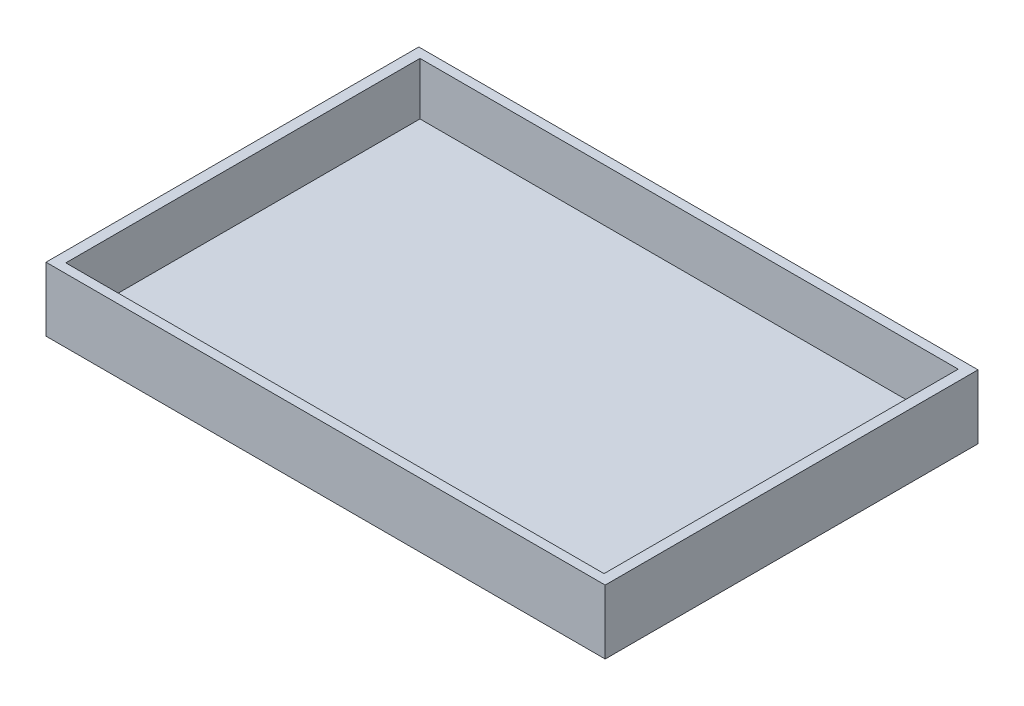
ISO-10303-21;
HEADER;
FILE_DESCRIPTION(('STEP AP214'),'2;1');
FILE_NAME('part.step','',(''),(''),'','','');
FILE_SCHEMA(('AUTOMOTIVE_DESIGN { 1 0 10303 214 1 1 1 1 }'));
ENDSEC;
DATA;
#1=APPLICATION_CONTEXT('core data for automotive mechanical design processes');
#2=APPLICATION_PROTOCOL_DEFINITION('international standard','automotive_design',2000,#1);
#3=PRODUCT_CONTEXT('',#1,'mechanical');
#4=PRODUCT('Part','Part','',(#3));
#5=PRODUCT_RELATED_PRODUCT_CATEGORY('part','',(#4));
#6=PRODUCT_DEFINITION_FORMATION('','',#4);
#7=PRODUCT_DEFINITION_CONTEXT('part definition',#1,'design');
#8=PRODUCT_DEFINITION('design','',#6,#7);
#9=PRODUCT_DEFINITION_SHAPE('','',#8);
#10=(LENGTH_UNIT() NAMED_UNIT(*) SI_UNIT(.MILLI.,.METRE.));
#11=(NAMED_UNIT(*) PLANE_ANGLE_UNIT() SI_UNIT($,.RADIAN.));
#12=(NAMED_UNIT(*) SI_UNIT($,.STERADIAN.) SOLID_ANGLE_UNIT());
#13=UNCERTAINTY_MEASURE_WITH_UNIT(LENGTH_MEASURE(1.E-05),#10,'distance_accuracy_value','');
#14=(GEOMETRIC_REPRESENTATION_CONTEXT(3) GLOBAL_UNCERTAINTY_ASSIGNED_CONTEXT((#13)) GLOBAL_UNIT_ASSIGNED_CONTEXT((#10,
#11,#12)) REPRESENTATION_CONTEXT('',''));
#15=CARTESIAN_POINT('',(0.,0.,0.));
#16=DIRECTION('',(0.,0.,1.));
#17=DIRECTION('',(1.,0.,0.));
#18=AXIS2_PLACEMENT_3D('',#15,#16,#17);
#19=CARTESIAN_POINT('',(-24.,5.5,16.));
#20=DIRECTION('',(-1.,0.,0.));
#21=DIRECTION('',(0.,0.,1.));
#22=AXIS2_PLACEMENT_3D('',#19,#20,#21);
#23=PLANE('',#22);
#24=DIRECTION('',(0.,0.,-1.));
#25=VECTOR('',#24,1.);
#26=CARTESIAN_POINT('',(-24.,0.,16.));
#27=LINE('',#26,#25);
#28=CARTESIAN_POINT('',(-24.,0.,16.));
#29=VERTEX_POINT('',#28);
#30=CARTESIAN_POINT('',(-24.,0.,-16.));
#31=VERTEX_POINT('',#30);
#32=EDGE_CURVE('E140',#29,#31,#27,.T.);
#33=ORIENTED_EDGE('',*,*,#32,.F.);
#34=DIRECTION('',(0.,-1.,0.));
#35=VECTOR('',#34,1.);
#36=CARTESIAN_POINT('',(-24.,5.5,16.));
#37=LINE('',#36,#35);
#38=CARTESIAN_POINT('',(-24.,5.5,16.));
#39=VERTEX_POINT('',#38);
#40=EDGE_CURVE('E11',#39,#29,#37,.T.);
#41=ORIENTED_EDGE('',*,*,#40,.F.);
#42=DIRECTION('',(0.,0.,-1.));
#43=VECTOR('',#42,1.);
#44=CARTESIAN_POINT('',(-24.,5.5,16.));
#45=LINE('',#44,#43);
#46=CARTESIAN_POINT('',(-24.,5.5,-16.));
#47=VERTEX_POINT('',#46);
#48=EDGE_CURVE('E144',#39,#47,#45,.T.);
#49=ORIENTED_EDGE('',*,*,#48,.T.);
#50=DIRECTION('',(0.,-1.,0.));
#51=VECTOR('',#50,1.);
#52=CARTESIAN_POINT('',(-24.,5.5,-16.));
#53=LINE('',#52,#51);
#54=EDGE_CURVE('E37',#47,#31,#53,.T.);
#55=ORIENTED_EDGE('',*,*,#54,.T.);
#56=EDGE_LOOP('',(#33,#41,#49,#55));
#57=FACE_BOUND('',#56,.T.);
#58=ADVANCED_FACE('F34',(#57),#23,.T.);
#59=CARTESIAN_POINT('',(-24.,5.5,16.));
#60=DIRECTION('',(0.,0.,-1.));
#61=DIRECTION('',(-1.,0.,0.));
#62=AXIS2_PLACEMENT_3D('',#59,#60,#61);
#63=PLANE('',#62);
#64=DIRECTION('',(1.,0.,0.));
#65=VECTOR('',#64,1.);
#66=CARTESIAN_POINT('',(-24.,0.,16.));
#67=LINE('',#66,#65);
#68=CARTESIAN_POINT('',(24.,0.,16.));
#69=VERTEX_POINT('',#68);
#70=EDGE_CURVE('E147',#29,#69,#67,.T.);
#71=ORIENTED_EDGE('',*,*,#70,.T.);
#72=DIRECTION('',(0.,-1.,0.));
#73=VECTOR('',#72,1.);
#74=CARTESIAN_POINT('',(24.,5.5,16.));
#75=LINE('',#74,#73);
#76=CARTESIAN_POINT('',(24.,5.5,16.));
#77=VERTEX_POINT('',#76);
#78=EDGE_CURVE('E42',#77,#69,#75,.T.);
#79=ORIENTED_EDGE('',*,*,#78,.F.);
#80=DIRECTION('',(1.,0.,0.));
#81=VECTOR('',#80,1.);
#82=CARTESIAN_POINT('',(-24.,5.5,16.));
#83=LINE('',#82,#81);
#84=EDGE_CURVE('E151',#39,#77,#83,.T.);
#85=ORIENTED_EDGE('',*,*,#84,.F.);
#86=ORIENTED_EDGE('',*,*,#40,.T.);
#87=EDGE_LOOP('',(#71,#79,#85,#86));
#88=FACE_BOUND('',#87,.T.);
#89=ADVANCED_FACE('F171',(#88),#63,.F.);
#90=CARTESIAN_POINT('',(24.,5.5,16.));
#91=DIRECTION('',(-1.,0.,0.));
#92=DIRECTION('',(0.,0.,1.));
#93=AXIS2_PLACEMENT_3D('',#90,#91,#92);
#94=PLANE('',#93);
#95=DIRECTION('',(0.,0.,-1.));
#96=VECTOR('',#95,1.);
#97=CARTESIAN_POINT('',(24.,0.,16.));
#98=LINE('',#97,#96);
#99=CARTESIAN_POINT('',(24.,0.,-16.));
#100=VERTEX_POINT('',#99);
#101=EDGE_CURVE('E158',#69,#100,#98,.T.);
#102=ORIENTED_EDGE('',*,*,#101,.T.);
#103=DIRECTION('',(0.,-1.,0.));
#104=VECTOR('',#103,1.);
#105=CARTESIAN_POINT('',(24.,5.5,-16.));
#106=LINE('',#105,#104);
#107=CARTESIAN_POINT('',(24.,5.5,-16.));
#108=VERTEX_POINT('',#107);
#109=EDGE_CURVE('E163',#108,#100,#106,.T.);
#110=ORIENTED_EDGE('',*,*,#109,.F.);
#111=DIRECTION('',(0.,0.,-1.));
#112=VECTOR('',#111,1.);
#113=CARTESIAN_POINT('',(24.,5.5,16.));
#114=LINE('',#113,#112);
#115=EDGE_CURVE('E149',#77,#108,#114,.T.);
#116=ORIENTED_EDGE('',*,*,#115,.F.);
#117=ORIENTED_EDGE('',*,*,#78,.T.);
#118=EDGE_LOOP('',(#102,#110,#116,#117));
#119=FACE_BOUND('',#118,.T.);
#120=ADVANCED_FACE('F174',(#119),#94,.F.);
#121=CARTESIAN_POINT('',(-24.,5.5,-16.));
#122=DIRECTION('',(0.,0.,-1.));
#123=DIRECTION('',(-1.,0.,0.));
#124=AXIS2_PLACEMENT_3D('',#121,#122,#123);
#125=PLANE('',#124);
#126=DIRECTION('',(1.,0.,0.));
#127=VECTOR('',#126,1.);
#128=CARTESIAN_POINT('',(-24.,0.,-16.));
#129=LINE('',#128,#127);
#130=EDGE_CURVE('E155',#31,#100,#129,.T.);
#131=ORIENTED_EDGE('',*,*,#130,.F.);
#132=ORIENTED_EDGE('',*,*,#54,.F.);
#133=DIRECTION('',(1.,0.,0.));
#134=VECTOR('',#133,1.);
#135=CARTESIAN_POINT('',(-24.,5.5,-16.));
#136=LINE('',#135,#134);
#137=EDGE_CURVE('E146',#47,#108,#136,.T.);
#138=ORIENTED_EDGE('',*,*,#137,.T.);
#139=ORIENTED_EDGE('',*,*,#109,.T.);
#140=EDGE_LOOP('',(#131,#132,#138,#139));
#141=FACE_BOUND('',#140,.T.);
#142=ADVANCED_FACE('F166',(#141),#125,.T.);
#143=CARTESIAN_POINT('',(0.,5.5,0.));
#144=DIRECTION('',(0.,-1.,0.));
#145=DIRECTION('',(0.,0.,-1.));
#146=AXIS2_PLACEMENT_3D('',#143,#144,#145);
#147=PLANE('',#146);
#148=DIRECTION('',(-1.,0.,0.));
#149=VECTOR('',#148,1.);
#150=CARTESIAN_POINT('',(-23.1,5.5,-15.2));
#151=LINE('',#150,#149);
#152=CARTESIAN_POINT('',(23.1,5.5,-15.2));
#153=VERTEX_POINT('',#152);
#154=CARTESIAN_POINT('',(-23.1,5.5,-15.2));
#155=VERTEX_POINT('',#154);
#156=EDGE_CURVE('E134',#153,#155,#151,.T.);
#157=ORIENTED_EDGE('',*,*,#156,.F.);
#158=DIRECTION('',(0.,0.,-1.));
#159=VECTOR('',#158,1.);
#160=CARTESIAN_POINT('',(23.1,5.5,15.2));
#161=LINE('',#160,#159);
#162=CARTESIAN_POINT('',(23.1,5.5,15.2));
#163=VERTEX_POINT('',#162);
#164=EDGE_CURVE('E50',#163,#153,#161,.T.);
#165=ORIENTED_EDGE('',*,*,#164,.F.);
#166=DIRECTION('',(1.,0.,0.));
#167=VECTOR('',#166,1.);
#168=CARTESIAN_POINT('',(-23.1,5.5,15.2));
#169=LINE('',#168,#167);
#170=CARTESIAN_POINT('',(-23.1,5.5,15.2));
#171=VERTEX_POINT('',#170);
#172=EDGE_CURVE('E125',#171,#163,#169,.T.);
#173=ORIENTED_EDGE('',*,*,#172,.F.);
#174=DIRECTION('',(0.,0.,1.));
#175=VECTOR('',#174,1.);
#176=CARTESIAN_POINT('',(-23.1,5.5,15.2));
#177=LINE('',#176,#175);
#178=EDGE_CURVE('E128',#155,#171,#177,.T.);
#179=ORIENTED_EDGE('',*,*,#178,.F.);
#180=EDGE_LOOP('',(#157,#165,#173,#179));
#181=FACE_BOUND('',#180,.T.);
#182=ORIENTED_EDGE('',*,*,#48,.F.);
#183=ORIENTED_EDGE('',*,*,#84,.T.);
#184=ORIENTED_EDGE('',*,*,#115,.T.);
#185=ORIENTED_EDGE('',*,*,#137,.F.);
#186=EDGE_LOOP('',(#182,#183,#184,#185));
#187=FACE_BOUND('',#186,.T.);
#188=ADVANCED_FACE('F176',(#181,#187),#147,.F.);
#189=CARTESIAN_POINT('',(0.,0.,0.));
#190=DIRECTION('',(0.,-1.,0.));
#191=DIRECTION('',(0.,0.,-1.));
#192=AXIS2_PLACEMENT_3D('',#189,#190,#191);
#193=PLANE('',#192);
#194=ORIENTED_EDGE('',*,*,#32,.T.);
#195=ORIENTED_EDGE('',*,*,#130,.T.);
#196=ORIENTED_EDGE('',*,*,#101,.F.);
#197=ORIENTED_EDGE('',*,*,#70,.F.);
#198=EDGE_LOOP('',(#194,#195,#196,#197));
#199=FACE_BOUND('',#198,.T.);
#200=ADVANCED_FACE('F169',(#199),#193,.T.);
#201=CARTESIAN_POINT('',(23.1,1.,15.2));
#202=DIRECTION('',(1.,0.,0.));
#203=DIRECTION('',(0.,0.,-1.));
#204=AXIS2_PLACEMENT_3D('',#201,#202,#203);
#205=PLANE('',#204);
#206=ORIENTED_EDGE('',*,*,#164,.T.);
#207=DIRECTION('',(0.,1.,0.));
#208=VECTOR('',#207,1.);
#209=CARTESIAN_POINT('',(23.1,1.,-15.2));
#210=LINE('',#209,#208);
#211=CARTESIAN_POINT('',(23.1,1.,-15.2));
#212=VERTEX_POINT('',#211);
#213=EDGE_CURVE('E103',#212,#153,#210,.T.);
#214=ORIENTED_EDGE('',*,*,#213,.F.);
#215=DIRECTION('',(0.,0.,-1.));
#216=VECTOR('',#215,1.);
#217=CARTESIAN_POINT('',(23.1,1.,15.2));
#218=LINE('',#217,#216);
#219=CARTESIAN_POINT('',(23.1,1.,15.2));
#220=VERTEX_POINT('',#219);
#221=EDGE_CURVE('E107',#220,#212,#218,.T.);
#222=ORIENTED_EDGE('',*,*,#221,.F.);
#223=DIRECTION('',(0.,1.,0.));
#224=VECTOR('',#223,1.);
#225=CARTESIAN_POINT('',(23.1,1.,15.2));
#226=LINE('',#225,#224);
#227=EDGE_CURVE('E138',#220,#163,#226,.T.);
#228=ORIENTED_EDGE('',*,*,#227,.T.);
#229=EDGE_LOOP('',(#206,#214,#222,#228));
#230=FACE_BOUND('',#229,.T.);
#231=ADVANCED_FACE('F105',(#230),#205,.F.);
#232=CARTESIAN_POINT('',(-23.1,1.,15.2));
#233=DIRECTION('',(0.,0.,1.));
#234=DIRECTION('',(1.,0.,0.));
#235=AXIS2_PLACEMENT_3D('',#232,#233,#234);
#236=PLANE('',#235);
#237=ORIENTED_EDGE('',*,*,#172,.T.);
#238=ORIENTED_EDGE('',*,*,#227,.F.);
#239=DIRECTION('',(1.,0.,0.));
#240=VECTOR('',#239,1.);
#241=CARTESIAN_POINT('',(-23.1,1.,15.2));
#242=LINE('',#241,#240);
#243=CARTESIAN_POINT('',(-23.1,1.,15.2));
#244=VERTEX_POINT('',#243);
#245=EDGE_CURVE('E113',#244,#220,#242,.T.);
#246=ORIENTED_EDGE('',*,*,#245,.F.);
#247=DIRECTION('',(0.,1.,0.));
#248=VECTOR('',#247,1.);
#249=CARTESIAN_POINT('',(-23.1,1.,15.2));
#250=LINE('',#249,#248);
#251=EDGE_CURVE('E141',#244,#171,#250,.T.);
#252=ORIENTED_EDGE('',*,*,#251,.T.);
#253=EDGE_LOOP('',(#237,#238,#246,#252));
#254=FACE_BOUND('',#253,.T.);
#255=ADVANCED_FACE('F220',(#254),#236,.F.);
#256=CARTESIAN_POINT('',(-23.1,1.,15.2));
#257=DIRECTION('',(-1.,0.,0.));
#258=DIRECTION('',(0.,0.,1.));
#259=AXIS2_PLACEMENT_3D('',#256,#257,#258);
#260=PLANE('',#259);
#261=ORIENTED_EDGE('',*,*,#178,.T.);
#262=ORIENTED_EDGE('',*,*,#251,.F.);
#263=DIRECTION('',(0.,0.,1.));
#264=VECTOR('',#263,1.);
#265=CARTESIAN_POINT('',(-23.1,1.,15.2));
#266=LINE('',#265,#264);
#267=CARTESIAN_POINT('',(-23.1,1.,-15.2));
#268=VERTEX_POINT('',#267);
#269=EDGE_CURVE('E121',#268,#244,#266,.T.);
#270=ORIENTED_EDGE('',*,*,#269,.F.);
#271=DIRECTION('',(0.,1.,0.));
#272=VECTOR('',#271,1.);
#273=CARTESIAN_POINT('',(-23.1,1.,-15.2));
#274=LINE('',#273,#272);
#275=EDGE_CURVE('E112',#268,#155,#274,.T.);
#276=ORIENTED_EDGE('',*,*,#275,.T.);
#277=EDGE_LOOP('',(#261,#262,#270,#276));
#278=FACE_BOUND('',#277,.T.);
#279=ADVANCED_FACE('F228',(#278),#260,.F.);
#280=CARTESIAN_POINT('',(-23.1,1.,-15.2));
#281=DIRECTION('',(0.,0.,-1.));
#282=DIRECTION('',(-1.,0.,0.));
#283=AXIS2_PLACEMENT_3D('',#280,#281,#282);
#284=PLANE('',#283);
#285=ORIENTED_EDGE('',*,*,#156,.T.);
#286=ORIENTED_EDGE('',*,*,#275,.F.);
#287=DIRECTION('',(-1.,0.,0.));
#288=VECTOR('',#287,1.);
#289=CARTESIAN_POINT('',(-23.1,1.,-15.2));
#290=LINE('',#289,#288);
#291=EDGE_CURVE('E116',#212,#268,#290,.T.);
#292=ORIENTED_EDGE('',*,*,#291,.F.);
#293=ORIENTED_EDGE('',*,*,#213,.T.);
#294=EDGE_LOOP('',(#285,#286,#292,#293));
#295=FACE_BOUND('',#294,.T.);
#296=ADVANCED_FACE('F117',(#295),#284,.F.);
#297=CARTESIAN_POINT('',(0.,1.,0.));
#298=DIRECTION('',(0.,-1.,0.));
#299=DIRECTION('',(0.,0.,-1.));
#300=AXIS2_PLACEMENT_3D('',#297,#298,#299);
#301=PLANE('',#300);
#302=ORIENTED_EDGE('',*,*,#221,.T.);
#303=ORIENTED_EDGE('',*,*,#291,.T.);
#304=ORIENTED_EDGE('',*,*,#269,.T.);
#305=ORIENTED_EDGE('',*,*,#245,.T.);
#306=EDGE_LOOP('',(#302,#303,#304,#305));
#307=FACE_BOUND('',#306,.T.);
#308=ADVANCED_FACE('F123',(#307),#301,.F.);
#309=CLOSED_SHELL('',(#58,#89,#120,#142,#188,#200,#231,#255,#279,#296,#308));
#310=MANIFOLD_SOLID_BREP('B2',#309);
#311=ADVANCED_BREP_SHAPE_REPRESENTATION('',(#18,#310),#14);
#312=SHAPE_DEFINITION_REPRESENTATION(#9,#311);
ENDSEC;
END-ISO-10303-21;
